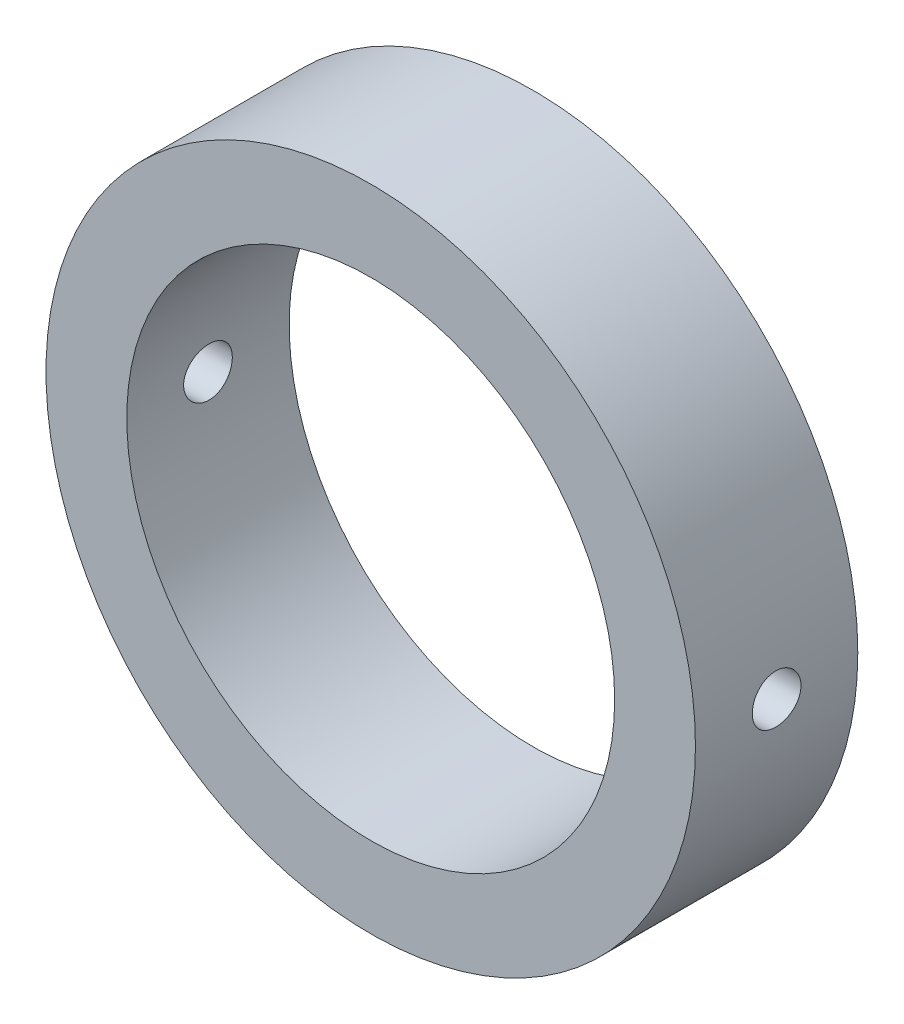
ISO-10303-21;
HEADER;
FILE_DESCRIPTION(('STEP AP214'),'2;1');
FILE_NAME('part.step','',(''),(''),'','','');
FILE_SCHEMA(('AUTOMOTIVE_DESIGN { 1 0 10303 214 1 1 1 1 }'));
ENDSEC;
DATA;
#1=APPLICATION_CONTEXT('core data for automotive mechanical design processes');
#2=APPLICATION_PROTOCOL_DEFINITION('international standard','automotive_design',2000,#1);
#3=PRODUCT_CONTEXT('',#1,'mechanical');
#4=PRODUCT('Part','Part','',(#3));
#5=PRODUCT_RELATED_PRODUCT_CATEGORY('part','',(#4));
#6=PRODUCT_DEFINITION_FORMATION('','',#4);
#7=PRODUCT_DEFINITION_CONTEXT('part definition',#1,'design');
#8=PRODUCT_DEFINITION('design','',#6,#7);
#9=PRODUCT_DEFINITION_SHAPE('','',#8);
#10=(LENGTH_UNIT() NAMED_UNIT(*) SI_UNIT(.MILLI.,.METRE.));
#11=(NAMED_UNIT(*) PLANE_ANGLE_UNIT() SI_UNIT($,.RADIAN.));
#12=(NAMED_UNIT(*) SI_UNIT($,.STERADIAN.) SOLID_ANGLE_UNIT());
#13=UNCERTAINTY_MEASURE_WITH_UNIT(LENGTH_MEASURE(1.E-05),#10,'distance_accuracy_value','');
#14=(GEOMETRIC_REPRESENTATION_CONTEXT(3) GLOBAL_UNCERTAINTY_ASSIGNED_CONTEXT((#13)) GLOBAL_UNIT_ASSIGNED_CONTEXT((#10,
#11,#12)) REPRESENTATION_CONTEXT('',''));
#15=CARTESIAN_POINT('',(0.,0.,0.));
#16=DIRECTION('',(0.,0.,1.));
#17=DIRECTION('',(1.,0.,0.));
#18=AXIS2_PLACEMENT_3D('',#15,#16,#17);
#19=CARTESIAN_POINT('',(0.,0.,10.));
#20=DIRECTION('',(0.,0.,1.));
#21=DIRECTION('',(1.,0.,0.));
#22=AXIS2_PLACEMENT_3D('',#19,#20,#21);
#23=PLANE('',#22);
#24=CARTESIAN_POINT('',(0.,0.,10.));
#25=DIRECTION('',(0.,0.,1.));
#26=DIRECTION('',(1.,0.,0.));
#27=AXIS2_PLACEMENT_3D('',#24,#25,#26);
#28=CIRCLE('',#27,20.);
#29=CARTESIAN_POINT('',(20.,0.,10.));
#30=VERTEX_POINT('',#29);
#31=EDGE_CURVE('E10',#30,#30,#28,.T.);
#32=ORIENTED_EDGE('',*,*,#31,.T.);
#33=EDGE_LOOP('',(#32));
#34=FACE_BOUND('',#33,.T.);
#35=CARTESIAN_POINT('',(0.,0.,10.));
#36=DIRECTION('',(0.,0.,1.));
#37=DIRECTION('',(1.,0.,0.));
#38=AXIS2_PLACEMENT_3D('',#35,#36,#37);
#39=CIRCLE('',#38,15.025);
#40=CARTESIAN_POINT('',(15.025,0.,10.));
#41=VERTEX_POINT('',#40);
#42=EDGE_CURVE('E50',#41,#41,#39,.T.);
#43=ORIENTED_EDGE('',*,*,#42,.F.);
#44=EDGE_LOOP('',(#43));
#45=FACE_BOUND('',#44,.T.);
#46=ADVANCED_FACE('F31',(#34,#45),#23,.T.);
#47=CARTESIAN_POINT('',(0.,0.,0.));
#48=DIRECTION('',(0.,0.,1.));
#49=DIRECTION('',(1.,0.,0.));
#50=AXIS2_PLACEMENT_3D('',#47,#48,#49);
#51=PLANE('',#50);
#52=CARTESIAN_POINT('',(0.,0.,0.));
#53=DIRECTION('',(0.,0.,1.));
#54=DIRECTION('',(1.,0.,0.));
#55=AXIS2_PLACEMENT_3D('',#52,#53,#54);
#56=CIRCLE('',#55,20.);
#57=CARTESIAN_POINT('',(20.,0.,0.));
#58=VERTEX_POINT('',#57);
#59=EDGE_CURVE('E45',#58,#58,#56,.T.);
#60=ORIENTED_EDGE('',*,*,#59,.F.);
#61=EDGE_LOOP('',(#60));
#62=FACE_BOUND('',#61,.T.);
#63=CARTESIAN_POINT('',(0.,0.,0.));
#64=DIRECTION('',(0.,0.,1.));
#65=DIRECTION('',(1.,0.,0.));
#66=AXIS2_PLACEMENT_3D('',#63,#64,#65);
#67=CIRCLE('',#66,15.025);
#68=CARTESIAN_POINT('',(15.025,0.,0.));
#69=VERTEX_POINT('',#68);
#70=EDGE_CURVE('E53',#69,#69,#67,.T.);
#71=ORIENTED_EDGE('',*,*,#70,.T.);
#72=EDGE_LOOP('',(#71));
#73=FACE_BOUND('',#72,.T.);
#74=ADVANCED_FACE('F89',(#62,#73),#51,.F.);
#75=CARTESIAN_POINT('',(0.,0.,10.));
#76=DIRECTION('',(0.,0.,-1.));
#77=DIRECTION('',(-1.,0.,0.));
#78=AXIS2_PLACEMENT_3D('',#75,#76,#77);
#79=CYLINDRICAL_SURFACE('',#78,20.);
#80=CARTESIAN_POINT('',(-20.,0.,3.5));
#81=CARTESIAN_POINT('',(-19.9999992582729,0.0841288095114433,3.50000368681702));
#82=CARTESIAN_POINT('',(-19.9994635090758,0.168315601024087,3.50710145344059));
#83=CARTESIAN_POINT('',(-19.9973778078798,0.334361941971538,3.53531248454328));
#84=CARTESIAN_POINT('',(-19.9958266932389,0.416218711162994,3.55644181623698));
#85=CARTESIAN_POINT('',(-19.9918856268593,0.575175965959818,3.61210332811973));
#86=CARTESIAN_POINT('',(-19.9894961359011,0.652279036935092,3.6466281471085));
#87=CARTESIAN_POINT('',(-19.9841466247064,0.799576480678019,3.72808795286373));
#88=CARTESIAN_POINT('',(-19.9811867302827,0.86977237179985,3.77502020379597));
#89=CARTESIAN_POINT('',(-19.975021868989,1.00142895753255,3.88006922053751));
#90=CARTESIAN_POINT('',(-19.971816458291,1.06287322971852,3.93820654408423));
#91=CARTESIAN_POINT('',(-19.9655255838438,1.17514165369782,4.06397229734492));
#92=CARTESIAN_POINT('',(-19.9624401252546,1.22596534904266,4.13160113477407));
#93=CARTESIAN_POINT('',(-19.9567335395977,1.31560383874766,4.2745274548094));
#94=CARTESIAN_POINT('',(-19.954112961772,1.35440446810332,4.34983384503009));
#95=CARTESIAN_POINT('',(-19.9496376121017,1.41880489046782,4.5059153723438));
#96=CARTESIAN_POINT('',(-19.947782829037,1.44440487688688,4.58669042929261));
#97=CARTESIAN_POINT('',(-19.9450525889002,1.48163037657928,4.75125389240055));
#98=CARTESIAN_POINT('',(-19.9441752805014,1.49328231044217,4.83503629080762));
#99=CARTESIAN_POINT('',(-19.9434933892539,1.50236254574838,5.0033719532607));
#100=CARTESIAN_POINT('',(-19.943688789744,1.49979106810858,5.08792520531351));
#101=CARTESIAN_POINT('',(-19.9451285636931,1.48051934417569,5.25522181105389));
#102=CARTESIAN_POINT('',(-19.9463708093904,1.46384775676394,5.33796848696417));
#103=CARTESIAN_POINT('',(-19.9497609519804,1.4168935522692,5.49948569711558));
#104=CARTESIAN_POINT('',(-19.9519088562398,1.38661082447336,5.57825619900876));
#105=CARTESIAN_POINT('',(-19.9568707353614,1.31326167189701,5.72967671623884));
#106=CARTESIAN_POINT('',(-19.9596853828031,1.27018232726496,5.80232045017681));
#107=CARTESIAN_POINT('',(-19.9656629459514,1.17247213743423,5.93935666286487));
#108=CARTESIAN_POINT('',(-19.9688258673499,1.11784110342877,6.00374900672235));
#109=CARTESIAN_POINT('',(-19.9751530336147,0.998417278432274,6.12262125824358));
#110=CARTESIAN_POINT('',(-19.978317262423,0.933599700176314,6.17707626759472));
#111=CARTESIAN_POINT('',(-19.9842830152099,0.795729375934442,6.2743357635657));
#112=CARTESIAN_POINT('',(-19.9870845390023,0.722676625718591,6.31714024420127));
#113=CARTESIAN_POINT('',(-19.9920096041928,0.570393940216334,6.38988183024377));
#114=CARTESIAN_POINT('',(-19.994133091137,0.491163509428977,6.4198179022413));
#115=CARTESIAN_POINT('',(-19.9974621500133,0.328781652774542,6.46595581220485));
#116=CARTESIAN_POINT('',(-19.998667737375,0.245630292842572,6.48215788103766));
#117=CARTESIAN_POINT('',(-20.0000231735387,0.0779828437837503,6.50033680953895));
#118=CARTESIAN_POINT('',(-20.0001755757578,-0.00650949482532118,6.50234807465418));
#119=CARTESIAN_POINT('',(-19.9994142771364,-0.174630230993064,6.49217833193029));
#120=CARTESIAN_POINT('',(-19.9985005843262,-0.258258635054598,6.4799974309947));
#121=CARTESIAN_POINT('',(-19.9957115375324,-0.422180011176505,6.44181763118942));
#122=CARTESIAN_POINT('',(-19.9938372886011,-0.502476701646071,6.41583460944133));
#123=CARTESIAN_POINT('',(-19.989337809084,-0.657570327384029,6.35080430636328));
#124=CARTESIAN_POINT('',(-19.9867125688255,-0.732367191799398,6.31175685676318));
#125=CARTESIAN_POINT('',(-19.9809993255836,-0.87449495937676,6.22161916210213));
#126=CARTESIAN_POINT('',(-19.9779104477497,-0.941811320255547,6.17050604328117));
#127=CARTESIAN_POINT('',(-19.9716201639251,-1.06692059601702,6.05772107453092));
#128=CARTESIAN_POINT('',(-19.9684187563498,-1.1247133767348,5.99604907587674));
#129=CARTESIAN_POINT('',(-19.9622567375937,-1.22925234979154,5.86374805986788));
#130=CARTESIAN_POINT('',(-19.9592966224009,-1.27597614708765,5.79310132056702));
#131=CARTESIAN_POINT('',(-19.9539590285433,-1.35689744472608,5.64494480161846));
#132=CARTESIAN_POINT('',(-19.951581545017,-1.39109504958689,5.56743507924217));
#133=CARTESIAN_POINT('',(-19.9476809567371,-1.44595479238458,5.40783319251269));
#134=CARTESIAN_POINT('',(-19.9461569763152,-1.46663080672911,5.32574582014728));
#135=CARTESIAN_POINT('',(-19.9441328652441,-1.49390569339177,5.15925276898428));
#136=CARTESIAN_POINT('',(-19.9436327190765,-1.50050477907388,5.07484712534437));
#137=CARTESIAN_POINT('',(-19.9437130691626,-1.49943621553155,4.90633608675259));
#138=CARTESIAN_POINT('',(-19.9442908995857,-1.49180376085723,4.82223046510386));
#139=CARTESIAN_POINT('',(-19.9464564369575,-1.46256198193398,4.65649891629));
#140=CARTESIAN_POINT('',(-19.9480441455862,-1.44095263443385,4.5748729932502));
#141=CARTESIAN_POINT('',(-19.952049853556,-1.38437900273526,4.41641439157821));
#142=CARTESIAN_POINT('',(-19.9544678255495,-1.34941515840954,4.33958155516746));
#143=CARTESIAN_POINT('',(-19.9598616237908,-1.26712924619683,4.19287104228543));
#144=CARTESIAN_POINT('',(-19.9628374388208,-1.21980742681008,4.1229932259982));
#145=CARTESIAN_POINT('',(-19.9690203079162,-1.11401708946727,3.99199665002896));
#146=CARTESIAN_POINT('',(-19.972227887963,-1.05552268820001,3.9308988183599));
#147=CARTESIAN_POINT('',(-19.9785081329158,-0.929090973452717,3.81936594968916));
#148=CARTESIAN_POINT('',(-19.9815807648333,-0.861151367795685,3.76893350849394));
#149=CARTESIAN_POINT('',(-19.9872494022766,-0.717650416603837,3.68010883746089));
#150=CARTESIAN_POINT('',(-19.9898446437752,-0.642077148267444,3.64173583950897));
#151=CARTESIAN_POINT('',(-19.9942566719576,-0.485593917915209,3.57827171555969));
#152=CARTESIAN_POINT('',(-19.9960743603405,-0.404690263737666,3.55316519693175));
#153=CARTESIAN_POINT('',(-19.9982556200579,-0.269417916724369,3.52339801147305));
#154=CARTESIAN_POINT('',(-19.9989068154638,-0.215921192938043,3.51463528121058));
#155=CARTESIAN_POINT('',(-19.9997792437292,-0.10829098794799,3.50293509484769));
#156=CARTESIAN_POINT('',(-20.0000004774832,-0.0541575080690683,3.49999762662964));
#157=CARTESIAN_POINT('',(-20.,0.,3.5));
#158=B_SPLINE_CURVE_WITH_KNOTS('',3,(#80,#81,#82,#83,#84,#85,#86,#87,#88,#89,#90,#91,#92,#93,
#94,#95,#96,#97,#98,#99,#100,#101,#102,#103,#104,#105,#106,#107,#108,#109,#110,#111,#112,#113,
#114,#115,#116,#117,#118,#119,#120,#121,#122,#123,#124,#125,#126,#127,#128,#129,#130,#131,#132,
#133,#134,#135,#136,#137,#138,#139,#140,#141,#142,#143,#144,#145,#146,#147,#148,#149,#150,#151,
#152,#153,#154,#155,#156,#157),.UNSPECIFIED.,.T.,.F.,(4,2,2,2,2,2,2,2,2,2,2,2,2,2,2,2,2,2,2,2,2,
2,2,2,2,2,2,2,2,2,2,2,2,2,2,2,2,2,4),(0.,0.252188706341404,0.504666687116075,0.757006120137034,
1.00928995874569,1.2620411413344,1.51480318436672,1.76786189721254,2.02091690224424,
2.27349180470371,2.52606278420137,2.7781216361643,3.0301825384079,3.28249879898397,
3.53481918386621,3.78776333637314,4.04070761880367,4.29367221036427,4.54663254953898,
4.79897937776532,5.05132430518305,5.30337957695229,5.55543809532427,5.80797835211939,
6.06052216631005,6.31357265115638,6.56662102450254,6.8194093000692,7.07219374409736,
7.32435388202405,7.57651443943157,7.828666691847,8.08081387425119,8.33355244628146,
8.58635246072108,8.83955360771711,9.09246032562223,9.25480590484755,9.41715114636383),.UNSPECIFIED.);
#159=CARTESIAN_POINT('',(-20.,0.,3.5));
#160=VERTEX_POINT('',#159);
#161=EDGE_CURVE('E78',#160,#160,#158,.T.);
#162=ORIENTED_EDGE('',*,*,#161,.T.);
#163=EDGE_LOOP('',(#162));
#164=FACE_BOUND('',#163,.T.);
#165=CARTESIAN_POINT('',(20.,0.,3.5));
#166=CARTESIAN_POINT('',(19.9999992582729,-0.0841288095114433,3.50000368681702));
#167=CARTESIAN_POINT('',(19.9994635090758,-0.168315601024087,3.50710145344059));
#168=CARTESIAN_POINT('',(19.9973778078798,-0.334361941971538,3.53531248454328));
#169=CARTESIAN_POINT('',(19.9958266932389,-0.416218711162994,3.55644181623698));
#170=CARTESIAN_POINT('',(19.9918856268593,-0.575175965959818,3.61210332811973));
#171=CARTESIAN_POINT('',(19.9894961359011,-0.652279036935092,3.6466281471085));
#172=CARTESIAN_POINT('',(19.9841466247064,-0.799576480678019,3.72808795286373));
#173=CARTESIAN_POINT('',(19.9811867302827,-0.86977237179985,3.77502020379597));
#174=CARTESIAN_POINT('',(19.975021868989,-1.00142895753255,3.88006922053751));
#175=CARTESIAN_POINT('',(19.971816458291,-1.06287322971852,3.93820654408423));
#176=CARTESIAN_POINT('',(19.9655255838438,-1.17514165369782,4.06397229734492));
#177=CARTESIAN_POINT('',(19.9624401252546,-1.22596534904266,4.13160113477407));
#178=CARTESIAN_POINT('',(19.9567335395977,-1.31560383874766,4.2745274548094));
#179=CARTESIAN_POINT('',(19.954112961772,-1.35440446810332,4.34983384503009));
#180=CARTESIAN_POINT('',(19.9496376121017,-1.41880489046782,4.5059153723438));
#181=CARTESIAN_POINT('',(19.947782829037,-1.44440487688688,4.58669042929261));
#182=CARTESIAN_POINT('',(19.9450525889002,-1.48163037657928,4.75125389240055));
#183=CARTESIAN_POINT('',(19.9441752805014,-1.49328231044217,4.83503629080762));
#184=CARTESIAN_POINT('',(19.9434933892539,-1.50236254574838,5.0033719532607));
#185=CARTESIAN_POINT('',(19.943688789744,-1.49979106810858,5.08792520531351));
#186=CARTESIAN_POINT('',(19.9451285636931,-1.48051934417569,5.25522181105389));
#187=CARTESIAN_POINT('',(19.9463708093904,-1.46384775676394,5.33796848696417));
#188=CARTESIAN_POINT('',(19.9497609519804,-1.4168935522692,5.49948569711558));
#189=CARTESIAN_POINT('',(19.9519088562398,-1.38661082447336,5.57825619900876));
#190=CARTESIAN_POINT('',(19.9568707353614,-1.31326167189701,5.72967671623884));
#191=CARTESIAN_POINT('',(19.9596853828031,-1.27018232726496,5.80232045017681));
#192=CARTESIAN_POINT('',(19.9656629459514,-1.17247213743423,5.93935666286487));
#193=CARTESIAN_POINT('',(19.9688258673499,-1.11784110342877,6.00374900672235));
#194=CARTESIAN_POINT('',(19.9751530336147,-0.998417278432274,6.12262125824358));
#195=CARTESIAN_POINT('',(19.978317262423,-0.933599700176314,6.17707626759472));
#196=CARTESIAN_POINT('',(19.9842830152099,-0.795729375934442,6.2743357635657));
#197=CARTESIAN_POINT('',(19.9870845390023,-0.722676625718591,6.31714024420127));
#198=CARTESIAN_POINT('',(19.9920096041928,-0.570393940216334,6.38988183024377));
#199=CARTESIAN_POINT('',(19.994133091137,-0.491163509428977,6.4198179022413));
#200=CARTESIAN_POINT('',(19.9974621500133,-0.328781652774542,6.46595581220485));
#201=CARTESIAN_POINT('',(19.998667737375,-0.245630292842572,6.48215788103766));
#202=CARTESIAN_POINT('',(20.0000231735387,-0.0779828437837503,6.50033680953895));
#203=CARTESIAN_POINT('',(20.0001755757578,0.00650949482532118,6.50234807465418));
#204=CARTESIAN_POINT('',(19.9994142771364,0.174630230993064,6.49217833193029));
#205=CARTESIAN_POINT('',(19.9985005843262,0.258258635054598,6.4799974309947));
#206=CARTESIAN_POINT('',(19.9957115375324,0.422180011176505,6.44181763118942));
#207=CARTESIAN_POINT('',(19.9938372886011,0.502476701646071,6.41583460944133));
#208=CARTESIAN_POINT('',(19.989337809084,0.657570327384029,6.35080430636328));
#209=CARTESIAN_POINT('',(19.9867125688255,0.732367191799398,6.31175685676318));
#210=CARTESIAN_POINT('',(19.9809993255836,0.87449495937676,6.22161916210213));
#211=CARTESIAN_POINT('',(19.9779104477497,0.941811320255547,6.17050604328117));
#212=CARTESIAN_POINT('',(19.9716201639251,1.06692059601702,6.05772107453092));
#213=CARTESIAN_POINT('',(19.9684187563498,1.1247133767348,5.99604907587674));
#214=CARTESIAN_POINT('',(19.9622567375937,1.22925234979154,5.86374805986788));
#215=CARTESIAN_POINT('',(19.9592966224009,1.27597614708765,5.79310132056702));
#216=CARTESIAN_POINT('',(19.9539590285433,1.35689744472608,5.64494480161846));
#217=CARTESIAN_POINT('',(19.951581545017,1.39109504958689,5.56743507924217));
#218=CARTESIAN_POINT('',(19.9476809567371,1.44595479238458,5.40783319251269));
#219=CARTESIAN_POINT('',(19.9461569763152,1.46663080672911,5.32574582014728));
#220=CARTESIAN_POINT('',(19.9441328652441,1.49390569339177,5.15925276898428));
#221=CARTESIAN_POINT('',(19.9436327190765,1.50050477907388,5.07484712534437));
#222=CARTESIAN_POINT('',(19.9437130691626,1.49943621553155,4.90633608675259));
#223=CARTESIAN_POINT('',(19.9442908995857,1.49180376085723,4.82223046510386));
#224=CARTESIAN_POINT('',(19.9464564369575,1.46256198193398,4.65649891629));
#225=CARTESIAN_POINT('',(19.9480441455862,1.44095263443385,4.5748729932502));
#226=CARTESIAN_POINT('',(19.952049853556,1.38437900273526,4.41641439157821));
#227=CARTESIAN_POINT('',(19.9544678255495,1.34941515840954,4.33958155516746));
#228=CARTESIAN_POINT('',(19.9598616237908,1.26712924619683,4.19287104228543));
#229=CARTESIAN_POINT('',(19.9628374388208,1.21980742681008,4.1229932259982));
#230=CARTESIAN_POINT('',(19.9690203079162,1.11401708946727,3.99199665002896));
#231=CARTESIAN_POINT('',(19.972227887963,1.05552268820001,3.9308988183599));
#232=CARTESIAN_POINT('',(19.9785081329158,0.929090973452717,3.81936594968916));
#233=CARTESIAN_POINT('',(19.9815807648333,0.861151367795685,3.76893350849394));
#234=CARTESIAN_POINT('',(19.9872494022766,0.717650416603837,3.68010883746089));
#235=CARTESIAN_POINT('',(19.9898446437752,0.642077148267444,3.64173583950897));
#236=CARTESIAN_POINT('',(19.9942566719576,0.485593917915209,3.57827171555969));
#237=CARTESIAN_POINT('',(19.9960743603405,0.404690263737666,3.55316519693175));
#238=CARTESIAN_POINT('',(19.9982556200579,0.269417916724369,3.52339801147305));
#239=CARTESIAN_POINT('',(19.9989068154638,0.215921192938043,3.51463528121058));
#240=CARTESIAN_POINT('',(19.9997792437292,0.10829098794799,3.50293509484769));
#241=CARTESIAN_POINT('',(20.0000004774832,0.0541575080690683,3.49999762662964));
#242=CARTESIAN_POINT('',(20.,0.,3.5));
#243=B_SPLINE_CURVE_WITH_KNOTS('',3,(#165,#166,#167,#168,#169,#170,#171,#172,#173,#174,#175,
#176,#177,#178,#179,#180,#181,#182,#183,#184,#185,#186,#187,#188,#189,#190,#191,#192,#193,#194,
#195,#196,#197,#198,#199,#200,#201,#202,#203,#204,#205,#206,#207,#208,#209,#210,#211,#212,#213,
#214,#215,#216,#217,#218,#219,#220,#221,#222,#223,#224,#225,#226,#227,#228,#229,#230,#231,#232,
#233,#234,#235,#236,#237,#238,#239,#240,#241,#242),.UNSPECIFIED.,.T.,.F.,(4,2,2,2,2,2,2,2,2,2,2,
2,2,2,2,2,2,2,2,2,2,2,2,2,2,2,2,2,2,2,2,2,2,2,2,2,2,2,4),(0.,0.252188706341404,
0.504666687116075,0.757006120137034,1.00928995874569,1.2620411413344,1.51480318436672,
1.76786189721254,2.02091690224424,2.27349180470371,2.52606278420137,2.7781216361643,
3.0301825384079,3.28249879898397,3.53481918386621,3.78776333637314,4.04070761880367,
4.29367221036427,4.54663254953898,4.79897937776532,5.05132430518305,5.30337957695229,
5.55543809532427,5.80797835211939,6.06052216631005,6.31357265115638,6.56662102450254,
6.8194093000692,7.07219374409736,7.32435388202405,7.57651443943157,7.828666691847,
8.08081387425119,8.33355244628146,8.58635246072108,8.83955360771711,9.09246032562223,
9.25480590484755,9.41715114636383),.UNSPECIFIED.);
#244=CARTESIAN_POINT('',(20.,0.,3.5));
#245=VERTEX_POINT('',#244);
#246=EDGE_CURVE('E73',#245,#245,#243,.T.);
#247=ORIENTED_EDGE('',*,*,#246,.T.);
#248=EDGE_LOOP('',(#247));
#249=FACE_BOUND('',#248,.T.);
#250=ORIENTED_EDGE('',*,*,#31,.F.);
#251=EDGE_LOOP('',(#250));
#252=FACE_BOUND('',#251,.T.);
#253=ORIENTED_EDGE('',*,*,#59,.T.);
#254=EDGE_LOOP('',(#253));
#255=FACE_BOUND('',#254,.T.);
#256=ADVANCED_FACE('F33',(#164,#249,#252,#255),#79,.T.);
#257=CARTESIAN_POINT('',(0.,0.,10.));
#258=DIRECTION('',(0.,0.,-1.));
#259=DIRECTION('',(-1.,0.,0.));
#260=AXIS2_PLACEMENT_3D('',#257,#258,#259);
#261=CYLINDRICAL_SURFACE('',#260,15.025);
#262=CARTESIAN_POINT('',(-15.025,0.,6.5));
#263=CARTESIAN_POINT('',(-15.0249990342487,-0.0840312763604968,6.49999636075287));
#264=CARTESIAN_POINT('',(-15.0242875584133,-0.168118127552477,6.49291497113912));
#265=CARTESIAN_POINT('',(-15.0215177549498,-0.333960665744637,6.46477279298736));
#266=CARTESIAN_POINT('',(-15.0194579430533,-0.415713679999277,6.44369659838953));
#267=CARTESIAN_POINT('',(-15.0142239859728,-0.574462964299368,6.38818444059381));
#268=CARTESIAN_POINT('',(-15.0110505134357,-0.651462072746857,6.35375654045797));
#269=CARTESIAN_POINT('',(-15.0039440961154,-0.798571921911397,6.27253388789435));
#270=CARTESIAN_POINT('',(-15.0000113025223,-0.868684029727611,6.22574159668397));
#271=CARTESIAN_POINT('',(-14.9918110220191,-1.00029797798823,6.12093825447981));
#272=CARTESIAN_POINT('',(-14.9875425077867,-1.06177164783558,6.06289190340825));
#273=CARTESIAN_POINT('',(-14.9791603707912,-1.17412159543603,5.93730343823331));
#274=CARTESIAN_POINT('',(-14.9750467551956,-1.22499738328322,5.86976088539277));
#275=CARTESIAN_POINT('',(-14.9674296522479,-1.31480706421572,5.72692111133222));
#276=CARTESIAN_POINT('',(-14.9639274733079,-1.35371548056056,5.65160779600333));
#277=CARTESIAN_POINT('',(-14.9579424745082,-1.41832326999275,5.49547596966165));
#278=CARTESIAN_POINT('',(-14.9554596295422,-1.44402296841721,5.4146575942967));
#279=CARTESIAN_POINT('',(-14.9518036775731,-1.48140032708353,5.25009696378294));
#280=CARTESIAN_POINT('',(-14.9506262092174,-1.49312468981314,5.16636541488802));
#281=CARTESIAN_POINT('',(-14.9497007778271,-1.50236293019314,4.9981153390224));
#282=CARTESIAN_POINT('',(-14.9499527773363,-1.49987718018984,4.91359683273021));
#283=CARTESIAN_POINT('',(-14.9518538272635,-1.48080425193342,4.74649392888047));
#284=CARTESIAN_POINT('',(-14.9534978258851,-1.46426806429913,4.66390364576305));
#285=CARTESIAN_POINT('',(-14.9579897436282,-1.41764300118112,4.50267652565701));
#286=CARTESIAN_POINT('',(-14.9608376789645,-1.38755394316585,4.42403974193043));
#287=CARTESIAN_POINT('',(-14.9674223898619,-1.31462096474066,4.27279074108419));
#288=CARTESIAN_POINT('',(-14.9711607397354,-1.27175441873267,4.20018950545821));
#289=CARTESIAN_POINT('',(-14.9791037255039,-1.17449954761743,4.06319265168114));
#290=CARTESIAN_POINT('',(-14.983308374999,-1.12011088641372,3.99879727298008));
#291=CARTESIAN_POINT('',(-14.9917327082774,-1.00107087143827,3.87974377525551));
#292=CARTESIAN_POINT('',(-14.9959523769568,-0.936375480492119,3.82512967767484));
#293=CARTESIAN_POINT('',(-15.0039138484262,-0.798711394074051,3.72753022791479));
#294=CARTESIAN_POINT('',(-15.0076556506831,-0.725742689373237,3.6845448887075));
#295=CARTESIAN_POINT('',(-15.0142410120867,-0.573572810333299,3.61142492796664));
#296=CARTESIAN_POINT('',(-15.0170844153034,-0.494370557048875,3.58129253692929));
#297=CARTESIAN_POINT('',(-15.0215510058894,-0.33199621011432,3.53476606870129));
#298=CARTESIAN_POINT('',(-15.0231742296269,-0.248824234862865,3.518371582042));
#299=CARTESIAN_POINT('',(-15.0250128938687,-0.0812526234350783,3.49984214172082));
#300=CARTESIAN_POINT('',(-15.0252343315879,0.00314023249625264,3.49764644099155));
#301=CARTESIAN_POINT('',(-15.0242605538607,0.171092742057695,3.50741735424845));
#302=CARTESIAN_POINT('',(-15.0230653574884,0.254652406890958,3.51938377754997));
#303=CARTESIAN_POINT('',(-15.0193964627186,0.418391271126832,3.55708886049477));
#304=CARTESIAN_POINT('',(-15.0169254048129,0.498577083729186,3.5827990801826));
#305=CARTESIAN_POINT('',(-15.0109820127322,0.653497620924148,3.64723271153122));
#306=CARTESIAN_POINT('',(-15.0075096561794,0.728232223642042,3.68595641403079));
#307=CARTESIAN_POINT('',(-14.9999371477343,0.870403574766648,3.7754684614505));
#308=CARTESIAN_POINT('',(-14.9958349351249,0.937815080879677,3.82629672139142));
#309=CARTESIAN_POINT('',(-14.9874696532966,1.06317116652927,3.93851781925697));
#310=CARTESIAN_POINT('',(-14.983206580056,1.1211155091855,3.99991092144834));
#311=CARTESIAN_POINT('',(-14.9749820133799,1.22610333329739,4.13178401934632));
#312=CARTESIAN_POINT('',(-14.9710216571132,1.27310694904786,4.20229583416329));
#313=CARTESIAN_POINT('',(-14.96386818512,1.35460501029307,4.3502478249598));
#314=CARTESIAN_POINT('',(-14.9606750589321,1.38909962635501,4.4276879064506));
#315=CARTESIAN_POINT('',(-14.9554246501358,1.44453376209866,4.58716142359413));
#316=CARTESIAN_POINT('',(-14.9533653802128,1.46549700945464,4.66918654319484));
#317=CARTESIAN_POINT('',(-14.9506096474022,1.49335032708281,4.83561406353904));
#318=CARTESIAN_POINT('',(-14.9499131455708,1.50024079951307,4.92001639627896));
#319=CARTESIAN_POINT('',(-14.949962620215,1.49974739955969,5.08840622709714));
#320=CARTESIAN_POINT('',(-14.9507022682446,1.492426151669,5.17239391755334));
#321=CARTESIAN_POINT('',(-14.953527208513,1.4638484317007,5.33793988274112));
#322=CARTESIAN_POINT('',(-14.9556125022721,1.44259194387854,5.41949815472776));
#323=CARTESIAN_POINT('',(-14.9608920176855,1.38676439792541,5.57786972681829));
#324=CARTESIAN_POINT('',(-14.9640860870066,1.35219516874395,5.65468367703182));
#325=CARTESIAN_POINT('',(-14.9712235665677,1.27072990751235,5.80142897120118));
#326=CARTESIAN_POINT('',(-14.9751669725299,1.2238339458329,5.87136035444497));
#327=CARTESIAN_POINT('',(-14.9833796113125,1.11881126148895,6.00267634753484));
#328=CARTESIAN_POINT('',(-14.9876501515998,1.06063788002634,6.06402356018434));
#329=CARTESIAN_POINT('',(-14.996023941287,0.934803897525063,6.1761130678669));
#330=CARTESIAN_POINT('',(-15.0001271503655,0.867141027059857,6.22685281885768));
#331=CARTESIAN_POINT('',(-15.007714649021,0.724063094514081,6.31638714262873));
#332=CARTESIAN_POINT('',(-15.0111973586923,0.648628994142175,6.35515140252751));
#333=CARTESIAN_POINT('',(-15.017134252529,0.492335819095157,6.41941150381761));
#334=CARTESIAN_POINT('',(-15.0195895959914,0.411482979241978,6.44492230852592));
#335=CARTESIAN_POINT('',(-15.0225780185699,0.27514354909594,6.47558876907565));
#336=CARTESIAN_POINT('',(-15.0234820273733,0.220528544349617,6.48473047637445));
#337=CARTESIAN_POINT('',(-15.0246933347561,0.110617053291836,6.49693727727668));
#338=CARTESIAN_POINT('',(-15.025000635786,0.0553205697801664,6.50000239583681));
#339=CARTESIAN_POINT('',(-15.025,0.,6.5));
#340=B_SPLINE_CURVE_WITH_KNOTS('',3,(#262,#263,#264,#265,#266,#267,#268,#269,#270,#271,#272,
#273,#274,#275,#276,#277,#278,#279,#280,#281,#282,#283,#284,#285,#286,#287,#288,#289,#290,#291,
#292,#293,#294,#295,#296,#297,#298,#299,#300,#301,#302,#303,#304,#305,#306,#307,#308,#309,#310,
#311,#312,#313,#314,#315,#316,#317,#318,#319,#320,#321,#322,#323,#324,#325,#326,#327,#328,#329,
#330,#331,#332,#333,#334,#335,#336,#337,#338,#339),.UNSPECIFIED.,.T.,.F.,(4,2,2,2,2,2,2,2,2,2,2,
2,2,2,2,2,2,2,2,2,2,2,2,2,2,2,2,2,2,2,2,2,2,2,2,2,2,2,4),(0.,0.251891819284968,
0.504061392232939,0.756078917137622,1.00804631395586,1.26081721905238,1.51359980634134,
1.76691686358498,2.0202276812077,2.27268959529782,2.52514489418156,2.77668789845256,
3.02823429063388,3.28022877901413,3.53223061900628,3.78533957474956,4.03844881283912,
4.29160195756609,4.54474755660334,4.79680939508665,5.04886783974446,5.30040670903819,
5.5519512003567,5.80433693908273,6.05672899185058,6.3100267935602,6.56332114128278,
6.81617011415252,7.06901186124909,7.32074198029436,7.57247238375415,7.82416821596859,
8.07586261133618,8.32862148312157,8.58144090600232,8.83489512982991,9.08806257537516,
9.25389197604878,9.41972069565583),.UNSPECIFIED.);
#341=CARTESIAN_POINT('',(-15.025,0.,6.5));
#342=VERTEX_POINT('',#341);
#343=EDGE_CURVE('E36',#342,#342,#340,.T.);
#344=ORIENTED_EDGE('',*,*,#343,.F.);
#345=EDGE_LOOP('',(#344));
#346=FACE_BOUND('',#345,.T.);
#347=CARTESIAN_POINT('',(15.025,0.,3.5));
#348=CARTESIAN_POINT('',(15.0249990342487,-0.0840312763604969,3.50000363924713));
#349=CARTESIAN_POINT('',(15.0242875584133,-0.168118127552477,3.50708502886088));
#350=CARTESIAN_POINT('',(15.0215177549498,-0.333960665744637,3.53522720701264));
#351=CARTESIAN_POINT('',(15.0194579430533,-0.415713679999277,3.55630340161047));
#352=CARTESIAN_POINT('',(15.0142239859728,-0.574462964299368,3.61181555940619));
#353=CARTESIAN_POINT('',(15.0110505134357,-0.651462072746858,3.64624345954203));
#354=CARTESIAN_POINT('',(15.0039440961154,-0.798571921911397,3.72746611210565));
#355=CARTESIAN_POINT('',(15.0000113025223,-0.868684029727611,3.77425840331603));
#356=CARTESIAN_POINT('',(14.9918110220191,-1.00029797798823,3.87906174552019));
#357=CARTESIAN_POINT('',(14.9875425077867,-1.06177164783558,3.93710809659175));
#358=CARTESIAN_POINT('',(14.9791603707912,-1.17412159543603,4.06269656176669));
#359=CARTESIAN_POINT('',(14.9750467551956,-1.22499738328322,4.13023911460723));
#360=CARTESIAN_POINT('',(14.9674296522479,-1.31480706421572,4.27307888866778));
#361=CARTESIAN_POINT('',(14.9639274733079,-1.35371548056056,4.34839220399667));
#362=CARTESIAN_POINT('',(14.9579424745082,-1.41832326999275,4.50452403033835));
#363=CARTESIAN_POINT('',(14.9554596295422,-1.44402296841721,4.5853424057033));
#364=CARTESIAN_POINT('',(14.9518036775731,-1.48140032708353,4.74990303621706));
#365=CARTESIAN_POINT('',(14.9506262092174,-1.49312468981314,4.83363458511198));
#366=CARTESIAN_POINT('',(14.9497007778271,-1.50236293019314,5.0018846609776));
#367=CARTESIAN_POINT('',(14.9499527773363,-1.49987718018984,5.08640316726979));
#368=CARTESIAN_POINT('',(14.9518538272635,-1.48080425193342,5.25350607111953));
#369=CARTESIAN_POINT('',(14.9534978258851,-1.46426806429913,5.33609635423695));
#370=CARTESIAN_POINT('',(14.9579897436282,-1.41764300118112,5.49732347434299));
#371=CARTESIAN_POINT('',(14.9608376789645,-1.38755394316585,5.57596025806957));
#372=CARTESIAN_POINT('',(14.9674223898619,-1.31462096474066,5.72720925891581));
#373=CARTESIAN_POINT('',(14.9711607397354,-1.27175441873267,5.79981049454179));
#374=CARTESIAN_POINT('',(14.9791037255039,-1.17449954761743,5.93680734831886));
#375=CARTESIAN_POINT('',(14.983308374999,-1.12011088641372,6.00120272701992));
#376=CARTESIAN_POINT('',(14.9917327082774,-1.00107087143827,6.12025622474449));
#377=CARTESIAN_POINT('',(14.9959523769568,-0.936375480492119,6.17487032232516));
#378=CARTESIAN_POINT('',(15.0039138484262,-0.798711394074051,6.27246977208521));
#379=CARTESIAN_POINT('',(15.0076556506831,-0.725742689373237,6.3154551112925));
#380=CARTESIAN_POINT('',(15.0142410120867,-0.573572810333299,6.38857507203336));
#381=CARTESIAN_POINT('',(15.0170844153034,-0.494370557048875,6.41870746307071));
#382=CARTESIAN_POINT('',(15.0215510058894,-0.33199621011432,6.46523393129871));
#383=CARTESIAN_POINT('',(15.0231742296269,-0.248824234862865,6.481628417958));
#384=CARTESIAN_POINT('',(15.0250128938687,-0.0812526234350782,6.50015785827918));
#385=CARTESIAN_POINT('',(15.0252343315879,0.00314023249625253,6.50235355900845));
#386=CARTESIAN_POINT('',(15.0242605538607,0.171092742057695,6.49258264575155));
#387=CARTESIAN_POINT('',(15.0230653574884,0.254652406890958,6.48061622245003));
#388=CARTESIAN_POINT('',(15.0193964627186,0.418391271126832,6.44291113950523));
#389=CARTESIAN_POINT('',(15.0169254048129,0.498577083729186,6.4172009198174));
#390=CARTESIAN_POINT('',(15.0109820127322,0.653497620924148,6.35276728846878));
#391=CARTESIAN_POINT('',(15.0075096561794,0.728232223642042,6.31404358596921));
#392=CARTESIAN_POINT('',(14.9999371477343,0.870403574766648,6.2245315385495));
#393=CARTESIAN_POINT('',(14.9958349351249,0.937815080879677,6.17370327860858));
#394=CARTESIAN_POINT('',(14.9874696532966,1.06317116652927,6.06148218074303));
#395=CARTESIAN_POINT('',(14.9832065800561,1.1211155091855,6.00008907855166));
#396=CARTESIAN_POINT('',(14.9749820133799,1.22610333329739,5.86821598065368));
#397=CARTESIAN_POINT('',(14.9710216571132,1.27310694904785,5.79770416583671));
#398=CARTESIAN_POINT('',(14.96386818512,1.35460501029307,5.6497521750402));
#399=CARTESIAN_POINT('',(14.9606750589321,1.38909962635501,5.5723120935494));
#400=CARTESIAN_POINT('',(14.9554246501358,1.44453376209866,5.41283857640587));
#401=CARTESIAN_POINT('',(14.9533653802128,1.46549700945464,5.33081345680516));
#402=CARTESIAN_POINT('',(14.9506096474022,1.49335032708281,5.16438593646096));
#403=CARTESIAN_POINT('',(14.9499131455708,1.50024079951307,5.07998360372104));
#404=CARTESIAN_POINT('',(14.949962620215,1.49974739955969,4.91159377290286));
#405=CARTESIAN_POINT('',(14.9507022682446,1.492426151669,4.82760608244666));
#406=CARTESIAN_POINT('',(14.953527208513,1.4638484317007,4.66206011725888));
#407=CARTESIAN_POINT('',(14.9556125022721,1.44259194387854,4.58050184527224));
#408=CARTESIAN_POINT('',(14.9608920176855,1.38676439792541,4.42213027318171));
#409=CARTESIAN_POINT('',(14.9640860870066,1.35219516874395,4.34531632296818));
#410=CARTESIAN_POINT('',(14.9712235665677,1.27072990751235,4.19857102879882));
#411=CARTESIAN_POINT('',(14.9751669725299,1.2238339458329,4.12863964555503));
#412=CARTESIAN_POINT('',(14.9833796113125,1.11881126148895,3.99732365246516));
#413=CARTESIAN_POINT('',(14.9876501515998,1.06063788002634,3.93597643981566));
#414=CARTESIAN_POINT('',(14.996023941287,0.934803897525063,3.8238869321331));
#415=CARTESIAN_POINT('',(15.0001271503655,0.867141027059858,3.77314718114232));
#416=CARTESIAN_POINT('',(15.007714649021,0.724063094514081,3.68361285737127));
#417=CARTESIAN_POINT('',(15.0111973586923,0.648628994142175,3.64484859747249));
#418=CARTESIAN_POINT('',(15.017134252529,0.492335819095157,3.58058849618239));
#419=CARTESIAN_POINT('',(15.0195895959914,0.411482979241978,3.55507769147408));
#420=CARTESIAN_POINT('',(15.0225780185699,0.27514354909594,3.52441123092435));
#421=CARTESIAN_POINT('',(15.0234820273733,0.220528544349617,3.51526952362555));
#422=CARTESIAN_POINT('',(15.0246933347561,0.110617053291836,3.50306272272332));
#423=CARTESIAN_POINT('',(15.025000635786,0.0553205697801663,3.49999760416319));
#424=CARTESIAN_POINT('',(15.025,0.,3.5));
#425=B_SPLINE_CURVE_WITH_KNOTS('',3,(#347,#348,#349,#350,#351,#352,#353,#354,#355,#356,#357,
#358,#359,#360,#361,#362,#363,#364,#365,#366,#367,#368,#369,#370,#371,#372,#373,#374,#375,#376,
#377,#378,#379,#380,#381,#382,#383,#384,#385,#386,#387,#388,#389,#390,#391,#392,#393,#394,#395,
#396,#397,#398,#399,#400,#401,#402,#403,#404,#405,#406,#407,#408,#409,#410,#411,#412,#413,#414,
#415,#416,#417,#418,#419,#420,#421,#422,#423,#424),.UNSPECIFIED.,.T.,.F.,(4,2,2,2,2,2,2,2,2,2,2,
2,2,2,2,2,2,2,2,2,2,2,2,2,2,2,2,2,2,2,2,2,2,2,2,2,2,2,4),(0.,0.251891819284968,
0.504061392232939,0.756078917137622,1.00804631395586,1.26081721905238,1.51359980634134,
1.76691686358498,2.0202276812077,2.27268959529782,2.52514489418156,2.77668789845256,
3.02823429063388,3.28022877901413,3.53223061900628,3.78533957474956,4.03844881283912,
4.29160195756609,4.54474755660334,4.79680939508665,5.04886783974446,5.30040670903819,
5.5519512003567,5.80433693908273,6.05672899185058,6.3100267935602,6.56332114128278,
6.81617011415252,7.06901186124909,7.32074198029436,7.57247238375415,7.82416821596859,
8.07586261133618,8.32862148312157,8.58144090600232,8.83489512982991,9.08806257537516,
9.25389197604878,9.41972069565583),.UNSPECIFIED.);
#426=CARTESIAN_POINT('',(15.025,0.,3.5));
#427=VERTEX_POINT('',#426);
#428=EDGE_CURVE('E55',#427,#427,#425,.T.);
#429=ORIENTED_EDGE('',*,*,#428,.F.);
#430=EDGE_LOOP('',(#429));
#431=FACE_BOUND('',#430,.T.);
#432=ORIENTED_EDGE('',*,*,#42,.T.);
#433=EDGE_LOOP('',(#432));
#434=FACE_BOUND('',#433,.T.);
#435=ORIENTED_EDGE('',*,*,#70,.F.);
#436=EDGE_LOOP('',(#435));
#437=FACE_BOUND('',#436,.T.);
#438=ADVANCED_FACE('F60',(#346,#431,#434,#437),#261,.F.);
#439=CARTESIAN_POINT('',(-20.,0.,5.));
#440=DIRECTION('',(1.,0.,0.));
#441=DIRECTION('',(0.,0.,-1.));
#442=AXIS2_PLACEMENT_3D('',#439,#440,#441);
#443=CYLINDRICAL_SURFACE('',#442,1.5);
#444=ORIENTED_EDGE('',*,*,#428,.T.);
#445=EDGE_LOOP('',(#444));
#446=FACE_BOUND('',#445,.T.);
#447=ORIENTED_EDGE('',*,*,#246,.F.);
#448=EDGE_LOOP('',(#447));
#449=FACE_BOUND('',#448,.T.);
#450=ADVANCED_FACE('F66',(#446,#449),#443,.F.);
#451=ORIENTED_EDGE('',*,*,#343,.T.);
#452=EDGE_LOOP('',(#451));
#453=FACE_BOUND('',#452,.T.);
#454=ORIENTED_EDGE('',*,*,#161,.F.);
#455=EDGE_LOOP('',(#454));
#456=FACE_BOUND('',#455,.T.);
#457=ADVANCED_FACE('F63',(#453,#456),#443,.F.);
#458=CLOSED_SHELL('',(#46,#74,#256,#438,#450,#457));
#459=MANIFOLD_SOLID_BREP('B2',#458);
#460=ADVANCED_BREP_SHAPE_REPRESENTATION('',(#18,#459),#14);
#461=SHAPE_DEFINITION_REPRESENTATION(#9,#460);
ENDSEC;
END-ISO-10303-21;
